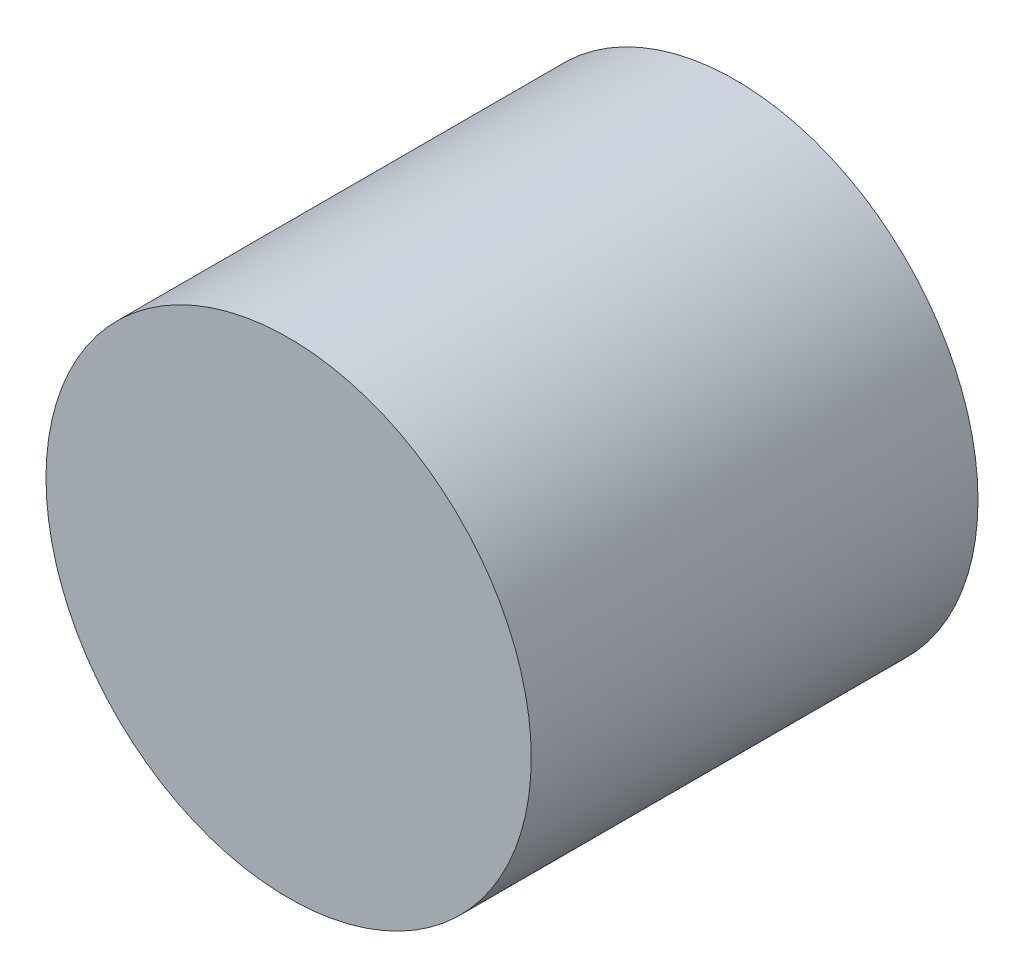
ISO-10303-21;
HEADER;
FILE_DESCRIPTION(('STEP AP214'),'2;1');
FILE_NAME('part.step','',(''),(''),'','','');
FILE_SCHEMA(('AUTOMOTIVE_DESIGN { 1 0 10303 214 1 1 1 1 }'));
ENDSEC;
DATA;
#1=APPLICATION_CONTEXT('core data for automotive mechanical design processes');
#2=APPLICATION_PROTOCOL_DEFINITION('international standard','automotive_design',2000,#1);
#3=PRODUCT_CONTEXT('',#1,'mechanical');
#4=PRODUCT('Part','Part','',(#3));
#5=PRODUCT_RELATED_PRODUCT_CATEGORY('part','',(#4));
#6=PRODUCT_DEFINITION_FORMATION('','',#4);
#7=PRODUCT_DEFINITION_CONTEXT('part definition',#1,'design');
#8=PRODUCT_DEFINITION('design','',#6,#7);
#9=PRODUCT_DEFINITION_SHAPE('','',#8);
#10=(LENGTH_UNIT() NAMED_UNIT(*) SI_UNIT(.MILLI.,.METRE.));
#11=(NAMED_UNIT(*) PLANE_ANGLE_UNIT() SI_UNIT($,.RADIAN.));
#12=(NAMED_UNIT(*) SI_UNIT($,.STERADIAN.) SOLID_ANGLE_UNIT());
#13=UNCERTAINTY_MEASURE_WITH_UNIT(LENGTH_MEASURE(1.E-05),#10,'distance_accuracy_value','');
#14=(GEOMETRIC_REPRESENTATION_CONTEXT(3) GLOBAL_UNCERTAINTY_ASSIGNED_CONTEXT((#13)) GLOBAL_UNIT_ASSIGNED_CONTEXT((#10,
#11,#12)) REPRESENTATION_CONTEXT('',''));
#15=CARTESIAN_POINT('',(0.,0.,0.));
#16=DIRECTION('',(0.,0.,1.));
#17=DIRECTION('',(1.,0.,0.));
#18=AXIS2_PLACEMENT_3D('',#15,#16,#17);
#19=CARTESIAN_POINT('',(3.14999878,0.,0.));
#20=DIRECTION('',(0.,0.,-1.));
#21=DIRECTION('',(-1.,0.,0.));
#22=AXIS2_PLACEMENT_3D('',#19,#20,#21);
#23=PLANE('',#22);
#24=CARTESIAN_POINT('',(0.,0.,0.));
#25=DIRECTION('',(0.,0.,-1.));
#26=DIRECTION('',(-1.,0.,0.));
#27=AXIS2_PLACEMENT_3D('',#24,#25,#26);
#28=CIRCLE('',#27,3.14999878);
#29=CARTESIAN_POINT('',(-3.14999878,0.,0.));
#30=VERTEX_POINT('',#29);
#31=EDGE_CURVE('E18',#30,#30,#28,.F.);
#32=ORIENTED_EDGE('',*,*,#31,.F.);
#33=EDGE_LOOP('',(#32));
#34=FACE_BOUND('',#33,.T.);
#35=ADVANCED_FACE('F15',(#34),#23,.T.);
#36=CARTESIAN_POINT('',(3.14999878,0.,5.8000011));
#37=DIRECTION('',(0.,0.,-1.));
#38=DIRECTION('',(-1.,0.,0.));
#39=AXIS2_PLACEMENT_3D('',#36,#37,#38);
#40=PLANE('',#39);
#41=CARTESIAN_POINT('',(0.,0.,5.8000011));
#42=DIRECTION('',(0.,0.,-1.));
#43=DIRECTION('',(-1.,0.,0.));
#44=AXIS2_PLACEMENT_3D('',#41,#42,#43);
#45=CIRCLE('',#44,3.14999878);
#46=CARTESIAN_POINT('',(-3.14999878,0.,5.8000011));
#47=VERTEX_POINT('',#46);
#48=EDGE_CURVE('E10',#47,#47,#45,.T.);
#49=ORIENTED_EDGE('',*,*,#48,.F.);
#50=EDGE_LOOP('',(#49));
#51=FACE_BOUND('',#50,.T.);
#52=ADVANCED_FACE('F30',(#51),#40,.F.);
#53=CARTESIAN_POINT('',(0.,0.,0.));
#54=DIRECTION('',(0.,0.,-1.));
#55=DIRECTION('',(-1.,0.,0.));
#56=AXIS2_PLACEMENT_3D('',#53,#54,#55);
#57=CYLINDRICAL_SURFACE('',#56,3.14999878);
#58=ORIENTED_EDGE('',*,*,#31,.T.);
#59=EDGE_LOOP('',(#58));
#60=FACE_BOUND('',#59,.T.);
#61=ORIENTED_EDGE('',*,*,#48,.T.);
#62=EDGE_LOOP('',(#61));
#63=FACE_BOUND('',#62,.T.);
#64=ADVANCED_FACE('F27',(#60,#63),#57,.T.);
#65=CLOSED_SHELL('',(#35,#52,#64));
#66=MANIFOLD_SOLID_BREP('B1',#65);
#67=ADVANCED_BREP_SHAPE_REPRESENTATION('',(#18,#66),#14);
#68=SHAPE_DEFINITION_REPRESENTATION(#9,#67);
ENDSEC;
END-ISO-10303-21;
